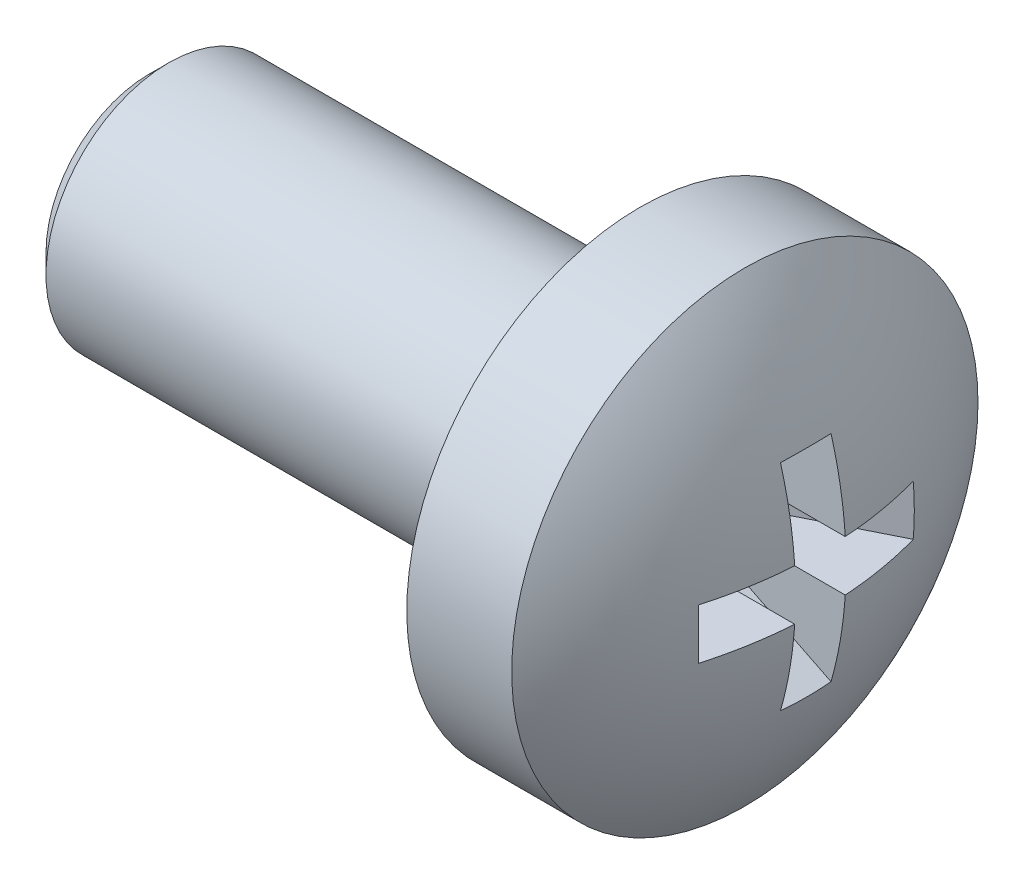
ISO-10303-21;
HEADER;
FILE_DESCRIPTION(('STEP AP214'),'2;1');
FILE_NAME('part.step','',(''),(''),'','','');
FILE_SCHEMA(('AUTOMOTIVE_DESIGN { 1 0 10303 214 1 1 1 1 }'));
ENDSEC;
DATA;
#1=APPLICATION_CONTEXT('core data for automotive mechanical design processes');
#2=APPLICATION_PROTOCOL_DEFINITION('international standard','automotive_design',2000,#1);
#3=PRODUCT_CONTEXT('',#1,'mechanical');
#4=PRODUCT('Part','Part','',(#3));
#5=PRODUCT_RELATED_PRODUCT_CATEGORY('part','',(#4));
#6=PRODUCT_DEFINITION_FORMATION('','',#4);
#7=PRODUCT_DEFINITION_CONTEXT('part definition',#1,'design');
#8=PRODUCT_DEFINITION('design','',#6,#7);
#9=PRODUCT_DEFINITION_SHAPE('','',#8);
#10=(LENGTH_UNIT() NAMED_UNIT(*) SI_UNIT(.MILLI.,.METRE.));
#11=(NAMED_UNIT(*) PLANE_ANGLE_UNIT() SI_UNIT($,.RADIAN.));
#12=(NAMED_UNIT(*) SI_UNIT($,.STERADIAN.) SOLID_ANGLE_UNIT());
#13=UNCERTAINTY_MEASURE_WITH_UNIT(LENGTH_MEASURE(1.E-05),#10,'distance_accuracy_value','');
#14=(GEOMETRIC_REPRESENTATION_CONTEXT(3) GLOBAL_UNCERTAINTY_ASSIGNED_CONTEXT((#13)) GLOBAL_UNIT_ASSIGNED_CONTEXT((#10,
#11,#12)) REPRESENTATION_CONTEXT('',''));
#15=CARTESIAN_POINT('',(0.,0.,0.));
#16=DIRECTION('',(0.,0.,1.));
#17=DIRECTION('',(1.,0.,0.));
#18=AXIS2_PLACEMENT_3D('',#15,#16,#17);
#19=CARTESIAN_POINT('',(-8.,0.,0.));
#20=DIRECTION('',(1.,0.,0.));
#21=DIRECTION('',(0.,-1.,0.));
#22=AXIS2_PLACEMENT_3D('',#19,#20,#21);
#23=SPHERICAL_SURFACE('',#22,8.);
#24=CARTESIAN_POINT('',(-7.34565681691376,0.,-1.31240938798552));
#25=DIRECTION('',(0.446197813109809,0.,-0.894934361602025));
#26=DIRECTION('',(-0.894934361602025,0.,-0.446197813109809));
#27=AXIS2_PLACEMENT_3D('',#24,#25,#26);
#28=CIRCLE('',#27,7.86444000530718);
#29=CARTESIAN_POINT('',(-0.322606080628619,0.515,2.18915454155237));
#30=VERTEX_POINT('',#29);
#31=CARTESIAN_POINT('',(-0.322606080628619,-0.515,2.18915454155237));
#32=VERTEX_POINT('',#31);
#33=EDGE_CURVE('E194',#30,#32,#28,.T.);
#34=ORIENTED_EDGE('',*,*,#33,.F.);
#35=CARTESIAN_POINT('',(-8.,0.515,0.));
#36=DIRECTION('',(0.,-1.,0.));
#37=DIRECTION('',(0.,0.,-1.));
#38=AXIS2_PLACEMENT_3D('',#35,#36,#37);
#39=CIRCLE('',#38,7.98340622792051);
#40=CARTESIAN_POINT('',(-0.0332221067736553,0.515,0.515));
#41=VERTEX_POINT('',#40);
#42=EDGE_CURVE('E113',#30,#41,#39,.F.);
#43=ORIENTED_EDGE('',*,*,#42,.T.);
#44=CARTESIAN_POINT('',(-8.,0.,0.515));
#45=DIRECTION('',(0.,0.,1.));
#46=DIRECTION('',(0.,-1.,0.));
#47=AXIS2_PLACEMENT_3D('',#44,#45,#46);
#48=CIRCLE('',#47,7.98340622792051);
#49=CARTESIAN_POINT('',(-0.32260608062862,2.18915454155236,0.515));
#50=VERTEX_POINT('',#49);
#51=EDGE_CURVE('E145',#50,#41,#48,.F.);
#52=ORIENTED_EDGE('',*,*,#51,.F.);
#53=CARTESIAN_POINT('',(-7.34565681691376,-1.31240938798552,0.));
#54=DIRECTION('',(0.446197813109809,-0.894934361602025,0.));
#55=DIRECTION('',(0.894934361602025,0.446197813109809,0.));
#56=AXIS2_PLACEMENT_3D('',#53,#54,#55);
#57=CIRCLE('',#56,7.86444000530718);
#58=CARTESIAN_POINT('',(-0.32260608062862,2.18915454155236,-0.515));
#59=VERTEX_POINT('',#58);
#60=EDGE_CURVE('E142',#50,#59,#57,.F.);
#61=ORIENTED_EDGE('',*,*,#60,.T.);
#62=CARTESIAN_POINT('',(-8.,0.,-0.515));
#63=DIRECTION('',(0.,0.,1.));
#64=DIRECTION('',(0.,-1.,0.));
#65=AXIS2_PLACEMENT_3D('',#62,#63,#64);
#66=CIRCLE('',#65,7.98340622792051);
#67=CARTESIAN_POINT('',(-0.0332221067736553,0.515,-0.515));
#68=VERTEX_POINT('',#67);
#69=EDGE_CURVE('E146',#59,#68,#66,.F.);
#70=ORIENTED_EDGE('',*,*,#69,.T.);
#71=CARTESIAN_POINT('',(-8.,0.515,0.));
#72=DIRECTION('',(0.,-1.,0.));
#73=DIRECTION('',(0.,0.,-1.));
#74=AXIS2_PLACEMENT_3D('',#71,#72,#73);
#75=CIRCLE('',#74,7.98340622792051);
#76=CARTESIAN_POINT('',(-0.322606080628619,0.515,-2.18915454155237));
#77=VERTEX_POINT('',#76);
#78=EDGE_CURVE('E196',#68,#77,#75,.F.);
#79=ORIENTED_EDGE('',*,*,#78,.T.);
#80=CARTESIAN_POINT('',(-7.34565681691376,0.,1.31240938798552));
#81=DIRECTION('',(0.446197813109809,0.,0.894934361602025));
#82=DIRECTION('',(0.894934361602025,0.,-0.446197813109809));
#83=AXIS2_PLACEMENT_3D('',#80,#81,#82);
#84=CIRCLE('',#83,7.86444000530718);
#85=CARTESIAN_POINT('',(-0.322606080628619,-0.515,-2.18915454155237));
#86=VERTEX_POINT('',#85);
#87=EDGE_CURVE('E199',#77,#86,#84,.F.);
#88=ORIENTED_EDGE('',*,*,#87,.T.);
#89=CARTESIAN_POINT('',(-8.,-0.515,0.));
#90=DIRECTION('',(0.,-1.,0.));
#91=DIRECTION('',(0.,0.,-1.));
#92=AXIS2_PLACEMENT_3D('',#89,#90,#91);
#93=CIRCLE('',#92,7.98340622792051);
#94=CARTESIAN_POINT('',(-0.0332221067736553,-0.515,-0.515));
#95=VERTEX_POINT('',#94);
#96=EDGE_CURVE('E200',#95,#86,#93,.F.);
#97=ORIENTED_EDGE('',*,*,#96,.F.);
#98=CARTESIAN_POINT('',(-8.,0.,-0.515));
#99=DIRECTION('',(0.,0.,1.));
#100=DIRECTION('',(0.,-1.,0.));
#101=AXIS2_PLACEMENT_3D('',#98,#99,#100);
#102=CIRCLE('',#101,7.98340622792051);
#103=CARTESIAN_POINT('',(-0.322606080628619,-2.18915454155237,-0.515));
#104=VERTEX_POINT('',#103);
#105=EDGE_CURVE('E156',#95,#104,#102,.F.);
#106=ORIENTED_EDGE('',*,*,#105,.T.);
#107=CARTESIAN_POINT('',(-7.34565681691376,1.31240938798552,0.));
#108=DIRECTION('',(0.446197813109809,0.894934361602025,0.));
#109=DIRECTION('',(-0.894934361602025,0.446197813109809,0.));
#110=AXIS2_PLACEMENT_3D('',#107,#108,#109);
#111=CIRCLE('',#110,7.86444000530718);
#112=CARTESIAN_POINT('',(-0.322606080628619,-2.18915454155237,0.515));
#113=VERTEX_POINT('',#112);
#114=EDGE_CURVE('E153',#113,#104,#111,.T.);
#115=ORIENTED_EDGE('',*,*,#114,.F.);
#116=CARTESIAN_POINT('',(-8.,0.,0.515));
#117=DIRECTION('',(0.,0.,1.));
#118=DIRECTION('',(0.,-1.,0.));
#119=AXIS2_PLACEMENT_3D('',#116,#117,#118);
#120=CIRCLE('',#119,7.98340622792051);
#121=CARTESIAN_POINT('',(-0.0332221067736553,-0.515,0.515));
#122=VERTEX_POINT('',#121);
#123=EDGE_CURVE('E157',#122,#113,#120,.F.);
#124=ORIENTED_EDGE('',*,*,#123,.F.);
#125=CARTESIAN_POINT('',(-8.,-0.515,0.));
#126=DIRECTION('',(0.,-1.,0.));
#127=DIRECTION('',(0.,0.,-1.));
#128=AXIS2_PLACEMENT_3D('',#125,#126,#127);
#129=CIRCLE('',#128,7.98340622792051);
#130=EDGE_CURVE('E192',#32,#122,#129,.F.);
#131=ORIENTED_EDGE('',*,*,#130,.F.);
#132=EDGE_LOOP('',(#34,#43,#52,#61,#70,#79,#88,#97,#106,#115,#124,#131));
#133=FACE_BOUND('',#132,.T.);
#134=CARTESIAN_POINT('',(-1.56280340520813,0.,0.));
#135=DIRECTION('',(1.,0.,0.));
#136=DIRECTION('',(0.,1.,0.));
#137=AXIS2_PLACEMENT_3D('',#134,#135,#136);
#138=CIRCLE('',#137,4.75);
#139=CARTESIAN_POINT('',(-1.56280340520814,4.75,0.));
#140=VERTEX_POINT('',#139);
#141=EDGE_CURVE('E117',#140,#140,#138,.T.);
#142=ORIENTED_EDGE('',*,*,#141,.T.);
#143=EDGE_LOOP('',(#142));
#144=FACE_BOUND('',#143,.T.);
#145=ADVANCED_FACE('F15',(#133,#144),#23,.T.);
#146=CARTESIAN_POINT('',(-13.7,0.,0.));
#147=DIRECTION('',(-1.,0.,0.));
#148=DIRECTION('',(0.,-1.,0.));
#149=AXIS2_PLACEMENT_3D('',#146,#147,#148);
#150=PLANE('',#149);
#151=CARTESIAN_POINT('',(-13.7,0.,0.));
#152=DIRECTION('',(-1.,0.,0.));
#153=DIRECTION('',(0.,-1.,0.));
#154=AXIS2_PLACEMENT_3D('',#151,#152,#153);
#155=CIRCLE('',#154,2.1);
#156=CARTESIAN_POINT('',(-13.7,-2.1,0.));
#157=VERTEX_POINT('',#156);
#158=EDGE_CURVE('E9',#157,#157,#155,.T.);
#159=ORIENTED_EDGE('',*,*,#158,.T.);
#160=EDGE_LOOP('',(#159));
#161=FACE_BOUND('',#160,.T.);
#162=ADVANCED_FACE('F261',(#161),#150,.T.);
#163=CARTESIAN_POINT('',(0.,0.,0.));
#164=DIRECTION('',(1.,0.,0.));
#165=DIRECTION('',(0.,1.,0.));
#166=AXIS2_PLACEMENT_3D('',#163,#164,#165);
#167=CYLINDRICAL_SURFACE('',#166,2.5);
#168=CARTESIAN_POINT('',(-13.3,0.,0.));
#169=DIRECTION('',(-1.,0.,0.));
#170=DIRECTION('',(0.,-1.,0.));
#171=AXIS2_PLACEMENT_3D('',#168,#169,#170);
#172=CIRCLE('',#171,2.5);
#173=CARTESIAN_POINT('',(-13.3,-2.5,0.));
#174=VERTEX_POINT('',#173);
#175=EDGE_CURVE('E25',#174,#174,#172,.F.);
#176=ORIENTED_EDGE('',*,*,#175,.T.);
#177=EDGE_LOOP('',(#176));
#178=FACE_BOUND('',#177,.T.);
#179=CARTESIAN_POINT('',(-3.7,0.,0.));
#180=DIRECTION('',(1.,0.,0.));
#181=DIRECTION('',(0.,1.,0.));
#182=AXIS2_PLACEMENT_3D('',#179,#180,#181);
#183=CIRCLE('',#182,2.5);
#184=CARTESIAN_POINT('',(-3.7,2.5,0.));
#185=VERTEX_POINT('',#184);
#186=EDGE_CURVE('E189',#185,#185,#183,.T.);
#187=ORIENTED_EDGE('',*,*,#186,.F.);
#188=EDGE_LOOP('',(#187));
#189=FACE_BOUND('',#188,.T.);
#190=ADVANCED_FACE('F267',(#178,#189),#167,.T.);
#191=CARTESIAN_POINT('',(-3.7,2.5,0.));
#192=DIRECTION('',(-1.,0.,0.));
#193=DIRECTION('',(0.,-1.,0.));
#194=AXIS2_PLACEMENT_3D('',#191,#192,#193);
#195=PLANE('',#194);
#196=ORIENTED_EDGE('',*,*,#186,.T.);
#197=EDGE_LOOP('',(#196));
#198=FACE_BOUND('',#197,.T.);
#199=CARTESIAN_POINT('',(-3.7,0.,0.));
#200=DIRECTION('',(1.,0.,0.));
#201=DIRECTION('',(0.,1.,0.));
#202=AXIS2_PLACEMENT_3D('',#199,#200,#201);
#203=CIRCLE('',#202,4.75);
#204=CARTESIAN_POINT('',(-3.7,4.75,0.));
#205=VERTEX_POINT('',#204);
#206=EDGE_CURVE('E186',#205,#205,#203,.T.);
#207=ORIENTED_EDGE('',*,*,#206,.F.);
#208=EDGE_LOOP('',(#207));
#209=FACE_BOUND('',#208,.T.);
#210=ADVANCED_FACE('F298',(#198,#209),#195,.T.);
#211=CARTESIAN_POINT('',(0.,0.,0.));
#212=DIRECTION('',(1.,0.,0.));
#213=DIRECTION('',(0.,1.,0.));
#214=AXIS2_PLACEMENT_3D('',#211,#212,#213);
#215=CYLINDRICAL_SURFACE('',#214,4.75);
#216=ORIENTED_EDGE('',*,*,#206,.T.);
#217=EDGE_LOOP('',(#216));
#218=FACE_BOUND('',#217,.T.);
#219=ORIENTED_EDGE('',*,*,#141,.F.);
#220=EDGE_LOOP('',(#219));
#221=FACE_BOUND('',#220,.T.);
#222=ADVANCED_FACE('F295',(#218,#221),#215,.T.);
#223=CARTESIAN_POINT('',(0.,0.,2.35));
#224=DIRECTION('',(0.446197813109809,0.,-0.894934361602025));
#225=DIRECTION('',(-0.894934361602025,0.,-0.446197813109809));
#226=AXIS2_PLACEMENT_3D('',#223,#224,#225);
#227=PLANE('',#226);
#228=ORIENTED_EDGE('',*,*,#33,.T.);
#229=DIRECTION('',(-0.894934361602025,0.,-0.446197813109809));
#230=VECTOR('',#229,1.);
#231=CARTESIAN_POINT('',(0.,-0.515,2.35));
#232=LINE('',#231,#230);
#233=CARTESIAN_POINT('',(-2.74,-0.515,0.983886393933594));
#234=VERTEX_POINT('',#233);
#235=EDGE_CURVE('E34',#234,#32,#232,.F.);
#236=ORIENTED_EDGE('',*,*,#235,.F.);
#237=DIRECTION('',(0.,1.,0.));
#238=VECTOR('',#237,1.);
#239=CARTESIAN_POINT('',(-2.74,0.,0.983886393933595));
#240=LINE('',#239,#238);
#241=CARTESIAN_POINT('',(-2.74,0.515,0.983886393933595));
#242=VERTEX_POINT('',#241);
#243=EDGE_CURVE('E125',#242,#234,#240,.F.);
#244=ORIENTED_EDGE('',*,*,#243,.F.);
#245=DIRECTION('',(-0.894934361602025,0.,-0.446197813109809));
#246=VECTOR('',#245,1.);
#247=CARTESIAN_POINT('',(0.,0.515,2.35));
#248=LINE('',#247,#246);
#249=EDGE_CURVE('E106',#242,#30,#248,.F.);
#250=ORIENTED_EDGE('',*,*,#249,.T.);
#251=EDGE_LOOP('',(#228,#236,#244,#250));
#252=FACE_BOUND('',#251,.T.);
#253=ADVANCED_FACE('F17',(#252),#227,.T.);
#254=CARTESIAN_POINT('',(-2.74,0.515,0.));
#255=DIRECTION('',(0.,-1.,0.));
#256=DIRECTION('',(0.,0.,-1.));
#257=AXIS2_PLACEMENT_3D('',#254,#255,#256);
#258=PLANE('',#257);
#259=ORIENTED_EDGE('',*,*,#249,.F.);
#260=DIRECTION('',(0.,0.,-1.));
#261=VECTOR('',#260,1.);
#262=CARTESIAN_POINT('',(-2.74,0.515,0.));
#263=LINE('',#262,#261);
#264=CARTESIAN_POINT('',(-2.74,0.515,0.515));
#265=VERTEX_POINT('',#264);
#266=EDGE_CURVE('E110',#242,#265,#263,.T.);
#267=ORIENTED_EDGE('',*,*,#266,.T.);
#268=DIRECTION('',(1.,0.,0.));
#269=VECTOR('',#268,1.);
#270=CARTESIAN_POINT('',(-2.74,0.515,0.515));
#271=LINE('',#270,#269);
#272=EDGE_CURVE('E118',#265,#41,#271,.T.);
#273=ORIENTED_EDGE('',*,*,#272,.T.);
#274=ORIENTED_EDGE('',*,*,#42,.F.);
#275=EDGE_LOOP('',(#259,#267,#273,#274));
#276=FACE_BOUND('',#275,.T.);
#277=ADVANCED_FACE('F108',(#276),#258,.T.);
#278=CARTESIAN_POINT('',(-2.74,0.,0.515));
#279=DIRECTION('',(0.,0.,1.));
#280=DIRECTION('',(0.,-1.,0.));
#281=AXIS2_PLACEMENT_3D('',#278,#279,#280);
#282=PLANE('',#281);
#283=ORIENTED_EDGE('',*,*,#51,.T.);
#284=ORIENTED_EDGE('',*,*,#272,.F.);
#285=DIRECTION('',(0.,-1.,0.));
#286=VECTOR('',#285,1.);
#287=CARTESIAN_POINT('',(-2.74,0.,0.515));
#288=LINE('',#287,#286);
#289=CARTESIAN_POINT('',(-2.74,0.983886393933595,0.515));
#290=VERTEX_POINT('',#289);
#291=EDGE_CURVE('E128',#290,#265,#288,.T.);
#292=ORIENTED_EDGE('',*,*,#291,.F.);
#293=DIRECTION('',(0.894934361602025,0.446197813109809,0.));
#294=VECTOR('',#293,1.);
#295=CARTESIAN_POINT('',(-3.13288330602388,0.788002003438862,0.515));
#296=LINE('',#295,#294);
#297=EDGE_CURVE('E138',#290,#50,#296,.T.);
#298=ORIENTED_EDGE('',*,*,#297,.T.);
#299=EDGE_LOOP('',(#283,#284,#292,#298));
#300=FACE_BOUND('',#299,.T.);
#301=ADVANCED_FACE('F249',(#300),#282,.F.);
#302=CARTESIAN_POINT('',(0.,2.35,0.));
#303=DIRECTION('',(0.446197813109809,-0.894934361602025,0.));
#304=DIRECTION('',(0.894934361602025,0.446197813109809,0.));
#305=AXIS2_PLACEMENT_3D('',#302,#303,#304);
#306=PLANE('',#305);
#307=ORIENTED_EDGE('',*,*,#297,.F.);
#308=DIRECTION('',(0.,0.,-1.));
#309=VECTOR('',#308,1.);
#310=CARTESIAN_POINT('',(-2.74,0.983886393933595,0.));
#311=LINE('',#310,#309);
#312=CARTESIAN_POINT('',(-2.74,0.983886393933595,-0.515));
#313=VERTEX_POINT('',#312);
#314=EDGE_CURVE('E150',#290,#313,#311,.T.);
#315=ORIENTED_EDGE('',*,*,#314,.T.);
#316=DIRECTION('',(0.894934361602025,0.446197813109809,0.));
#317=VECTOR('',#316,1.);
#318=CARTESIAN_POINT('',(-3.13288330602388,0.788002003438862,-0.515));
#319=LINE('',#318,#317);
#320=EDGE_CURVE('E141',#313,#59,#319,.T.);
#321=ORIENTED_EDGE('',*,*,#320,.T.);
#322=ORIENTED_EDGE('',*,*,#60,.F.);
#323=EDGE_LOOP('',(#307,#315,#321,#322));
#324=FACE_BOUND('',#323,.T.);
#325=ADVANCED_FACE('F247',(#324),#306,.T.);
#326=CARTESIAN_POINT('',(-2.74,0.,-0.515));
#327=DIRECTION('',(0.,0.,1.));
#328=DIRECTION('',(0.,-1.,0.));
#329=AXIS2_PLACEMENT_3D('',#326,#327,#328);
#330=PLANE('',#329);
#331=ORIENTED_EDGE('',*,*,#320,.F.);
#332=DIRECTION('',(0.,-1.,0.));
#333=VECTOR('',#332,1.);
#334=CARTESIAN_POINT('',(-2.74,0.,-0.515));
#335=LINE('',#334,#333);
#336=CARTESIAN_POINT('',(-2.74,0.515,-0.515));
#337=VERTEX_POINT('',#336);
#338=EDGE_CURVE('E152',#313,#337,#335,.T.);
#339=ORIENTED_EDGE('',*,*,#338,.T.);
#340=DIRECTION('',(1.,0.,0.));
#341=VECTOR('',#340,1.);
#342=CARTESIAN_POINT('',(-2.74,0.515,-0.515));
#343=LINE('',#342,#341);
#344=EDGE_CURVE('E149',#337,#68,#343,.T.);
#345=ORIENTED_EDGE('',*,*,#344,.T.);
#346=ORIENTED_EDGE('',*,*,#69,.F.);
#347=EDGE_LOOP('',(#331,#339,#345,#346));
#348=FACE_BOUND('',#347,.T.);
#349=ADVANCED_FACE('F244',(#348),#330,.T.);
#350=CARTESIAN_POINT('',(-2.74,0.515,0.));
#351=DIRECTION('',(0.,-1.,0.));
#352=DIRECTION('',(0.,0.,-1.));
#353=AXIS2_PLACEMENT_3D('',#350,#351,#352);
#354=PLANE('',#353);
#355=ORIENTED_EDGE('',*,*,#344,.F.);
#356=DIRECTION('',(0.,0.,-1.));
#357=VECTOR('',#356,1.);
#358=CARTESIAN_POINT('',(-2.74,0.515,0.));
#359=LINE('',#358,#357);
#360=CARTESIAN_POINT('',(-2.74,0.515,-0.983886393933595));
#361=VERTEX_POINT('',#360);
#362=EDGE_CURVE('E172',#337,#361,#359,.T.);
#363=ORIENTED_EDGE('',*,*,#362,.T.);
#364=DIRECTION('',(0.894934361602025,0.,-0.446197813109809));
#365=VECTOR('',#364,1.);
#366=CARTESIAN_POINT('',(0.,0.515,-2.35));
#367=LINE('',#366,#365);
#368=EDGE_CURVE('E179',#361,#77,#367,.T.);
#369=ORIENTED_EDGE('',*,*,#368,.T.);
#370=ORIENTED_EDGE('',*,*,#78,.F.);
#371=EDGE_LOOP('',(#355,#363,#369,#370));
#372=FACE_BOUND('',#371,.T.);
#373=ADVANCED_FACE('F241',(#372),#354,.T.);
#374=CARTESIAN_POINT('',(0.,0.,-2.35));
#375=DIRECTION('',(0.446197813109809,0.,0.894934361602025));
#376=DIRECTION('',(0.894934361602025,0.,-0.446197813109809));
#377=AXIS2_PLACEMENT_3D('',#374,#375,#376);
#378=PLANE('',#377);
#379=ORIENTED_EDGE('',*,*,#368,.F.);
#380=DIRECTION('',(0.,-1.,0.));
#381=VECTOR('',#380,1.);
#382=CARTESIAN_POINT('',(-2.74,0.,-0.983886393933595));
#383=LINE('',#382,#381);
#384=CARTESIAN_POINT('',(-2.74,-0.515,-0.983886393933594));
#385=VERTEX_POINT('',#384);
#386=EDGE_CURVE('E171',#361,#385,#383,.T.);
#387=ORIENTED_EDGE('',*,*,#386,.T.);
#388=DIRECTION('',(0.894934361602025,0.,-0.446197813109809));
#389=VECTOR('',#388,1.);
#390=CARTESIAN_POINT('',(0.,-0.515,-2.35));
#391=LINE('',#390,#389);
#392=EDGE_CURVE('E181',#385,#86,#391,.T.);
#393=ORIENTED_EDGE('',*,*,#392,.T.);
#394=ORIENTED_EDGE('',*,*,#87,.F.);
#395=EDGE_LOOP('',(#379,#387,#393,#394));
#396=FACE_BOUND('',#395,.T.);
#397=ADVANCED_FACE('F235',(#396),#378,.T.);
#398=CARTESIAN_POINT('',(-2.74,-0.515,0.));
#399=DIRECTION('',(0.,-1.,0.));
#400=DIRECTION('',(0.,0.,-1.));
#401=AXIS2_PLACEMENT_3D('',#398,#399,#400);
#402=PLANE('',#401);
#403=ORIENTED_EDGE('',*,*,#96,.T.);
#404=ORIENTED_EDGE('',*,*,#392,.F.);
#405=DIRECTION('',(0.,0.,-1.));
#406=VECTOR('',#405,1.);
#407=CARTESIAN_POINT('',(-2.74,-0.515,0.));
#408=LINE('',#407,#406);
#409=CARTESIAN_POINT('',(-2.74,-0.515,-0.515));
#410=VERTEX_POINT('',#409);
#411=EDGE_CURVE('E164',#410,#385,#408,.T.);
#412=ORIENTED_EDGE('',*,*,#411,.F.);
#413=DIRECTION('',(1.,0.,0.));
#414=VECTOR('',#413,1.);
#415=CARTESIAN_POINT('',(-2.74,-0.515,-0.515));
#416=LINE('',#415,#414);
#417=EDGE_CURVE('E78',#410,#95,#416,.T.);
#418=ORIENTED_EDGE('',*,*,#417,.T.);
#419=EDGE_LOOP('',(#403,#404,#412,#418));
#420=FACE_BOUND('',#419,.T.);
#421=ADVANCED_FACE('F231',(#420),#402,.F.);
#422=CARTESIAN_POINT('',(-2.74,0.,-0.515));
#423=DIRECTION('',(0.,0.,1.));
#424=DIRECTION('',(0.,-1.,0.));
#425=AXIS2_PLACEMENT_3D('',#422,#423,#424);
#426=PLANE('',#425);
#427=ORIENTED_EDGE('',*,*,#417,.F.);
#428=DIRECTION('',(0.,-1.,0.));
#429=VECTOR('',#428,1.);
#430=CARTESIAN_POINT('',(-2.74,0.,-0.515));
#431=LINE('',#430,#429);
#432=CARTESIAN_POINT('',(-2.74,-0.983886393933595,-0.515));
#433=VERTEX_POINT('',#432);
#434=EDGE_CURVE('E72',#410,#433,#431,.T.);
#435=ORIENTED_EDGE('',*,*,#434,.T.);
#436=DIRECTION('',(-0.894934361602025,0.446197813109809,0.));
#437=VECTOR('',#436,1.);
#438=CARTESIAN_POINT('',(-3.13288330602388,-0.788002003438862,-0.515));
#439=LINE('',#438,#437);
#440=EDGE_CURVE('E19',#433,#104,#439,.F.);
#441=ORIENTED_EDGE('',*,*,#440,.T.);
#442=ORIENTED_EDGE('',*,*,#105,.F.);
#443=EDGE_LOOP('',(#427,#435,#441,#442));
#444=FACE_BOUND('',#443,.T.);
#445=ADVANCED_FACE('F227',(#444),#426,.T.);
#446=CARTESIAN_POINT('',(0.,-2.35,0.));
#447=DIRECTION('',(0.446197813109809,0.894934361602025,0.));
#448=DIRECTION('',(-0.894934361602025,0.446197813109809,0.));
#449=AXIS2_PLACEMENT_3D('',#446,#447,#448);
#450=PLANE('',#449);
#451=ORIENTED_EDGE('',*,*,#114,.T.);
#452=ORIENTED_EDGE('',*,*,#440,.F.);
#453=DIRECTION('',(0.,0.,1.));
#454=VECTOR('',#453,1.);
#455=CARTESIAN_POINT('',(-2.74,-0.983886393933595,0.));
#456=LINE('',#455,#454);
#457=CARTESIAN_POINT('',(-2.74,-0.983886393933595,0.515));
#458=VERTEX_POINT('',#457);
#459=EDGE_CURVE('E160',#458,#433,#456,.F.);
#460=ORIENTED_EDGE('',*,*,#459,.F.);
#461=DIRECTION('',(-0.894934361602025,0.446197813109809,0.));
#462=VECTOR('',#461,1.);
#463=CARTESIAN_POINT('',(-3.13288330602388,-0.788002003438862,0.515));
#464=LINE('',#463,#462);
#465=EDGE_CURVE('E158',#458,#113,#464,.F.);
#466=ORIENTED_EDGE('',*,*,#465,.T.);
#467=EDGE_LOOP('',(#451,#452,#460,#466));
#468=FACE_BOUND('',#467,.T.);
#469=ADVANCED_FACE('F226',(#468),#450,.T.);
#470=CARTESIAN_POINT('',(-2.74,0.,0.515));
#471=DIRECTION('',(0.,0.,1.));
#472=DIRECTION('',(0.,-1.,0.));
#473=AXIS2_PLACEMENT_3D('',#470,#471,#472);
#474=PLANE('',#473);
#475=ORIENTED_EDGE('',*,*,#123,.T.);
#476=ORIENTED_EDGE('',*,*,#465,.F.);
#477=DIRECTION('',(0.,-1.,0.));
#478=VECTOR('',#477,1.);
#479=CARTESIAN_POINT('',(-2.74,0.,0.515));
#480=LINE('',#479,#478);
#481=CARTESIAN_POINT('',(-2.74,-0.515,0.515));
#482=VERTEX_POINT('',#481);
#483=EDGE_CURVE('E132',#482,#458,#480,.T.);
#484=ORIENTED_EDGE('',*,*,#483,.F.);
#485=DIRECTION('',(1.,0.,0.));
#486=VECTOR('',#485,1.);
#487=CARTESIAN_POINT('',(-2.74,-0.515,0.515));
#488=LINE('',#487,#486);
#489=EDGE_CURVE('E137',#482,#122,#488,.T.);
#490=ORIENTED_EDGE('',*,*,#489,.T.);
#491=EDGE_LOOP('',(#475,#476,#484,#490));
#492=FACE_BOUND('',#491,.T.);
#493=ADVANCED_FACE('F224',(#492),#474,.F.);
#494=CARTESIAN_POINT('',(-2.74,-0.515,0.));
#495=DIRECTION('',(0.,-1.,0.));
#496=DIRECTION('',(0.,0.,-1.));
#497=AXIS2_PLACEMENT_3D('',#494,#495,#496);
#498=PLANE('',#497);
#499=ORIENTED_EDGE('',*,*,#130,.T.);
#500=ORIENTED_EDGE('',*,*,#489,.F.);
#501=DIRECTION('',(0.,0.,-1.));
#502=VECTOR('',#501,1.);
#503=CARTESIAN_POINT('',(-2.74,-0.515,0.));
#504=LINE('',#503,#502);
#505=EDGE_CURVE('E130',#234,#482,#504,.T.);
#506=ORIENTED_EDGE('',*,*,#505,.F.);
#507=ORIENTED_EDGE('',*,*,#235,.T.);
#508=EDGE_LOOP('',(#499,#500,#506,#507));
#509=FACE_BOUND('',#508,.T.);
#510=ADVANCED_FACE('F222',(#509),#498,.F.);
#511=CARTESIAN_POINT('',(-2.74,0.,0.));
#512=DIRECTION('',(1.,0.,0.));
#513=DIRECTION('',(0.,0.,-1.));
#514=AXIS2_PLACEMENT_3D('',#511,#512,#513);
#515=PLANE('',#514);
#516=ORIENTED_EDGE('',*,*,#243,.T.);
#517=ORIENTED_EDGE('',*,*,#505,.T.);
#518=ORIENTED_EDGE('',*,*,#483,.T.);
#519=ORIENTED_EDGE('',*,*,#459,.T.);
#520=ORIENTED_EDGE('',*,*,#434,.F.);
#521=ORIENTED_EDGE('',*,*,#411,.T.);
#522=ORIENTED_EDGE('',*,*,#386,.F.);
#523=ORIENTED_EDGE('',*,*,#362,.F.);
#524=ORIENTED_EDGE('',*,*,#338,.F.);
#525=ORIENTED_EDGE('',*,*,#314,.F.);
#526=ORIENTED_EDGE('',*,*,#291,.T.);
#527=ORIENTED_EDGE('',*,*,#266,.F.);
#528=EDGE_LOOP('',(#516,#517,#518,#519,#520,#521,#522,#523,#524,#525,#526,#527));
#529=FACE_BOUND('',#528,.T.);
#530=ADVANCED_FACE('F123',(#529),#515,.T.);
#531=CARTESIAN_POINT('',(-13.3,0.,0.));
#532=DIRECTION('',(1.,0.,0.));
#533=DIRECTION('',(0.,1.,0.));
#534=AXIS2_PLACEMENT_3D('',#531,#532,#533);
#535=CONICAL_SURFACE('',#534,2.5,0.78539816339745);
#536=ORIENTED_EDGE('',*,*,#158,.F.);
#537=EDGE_LOOP('',(#536));
#538=FACE_BOUND('',#537,.T.);
#539=ORIENTED_EDGE('',*,*,#175,.F.);
#540=EDGE_LOOP('',(#539));
#541=FACE_BOUND('',#540,.T.);
#542=ADVANCED_FACE('F272',(#538,#541),#535,.T.);
#543=CLOSED_SHELL('',(#145,#162,#190,#210,#222,#253,#277,#301,#325,#349,#373,#397,#421,#445,
#469,#493,#510,#530,#542));
#544=MANIFOLD_SOLID_BREP('B1',#543);
#545=ADVANCED_BREP_SHAPE_REPRESENTATION('',(#18,#544),#14);
#546=SHAPE_DEFINITION_REPRESENTATION(#9,#545);
ENDSEC;
END-ISO-10303-21;
